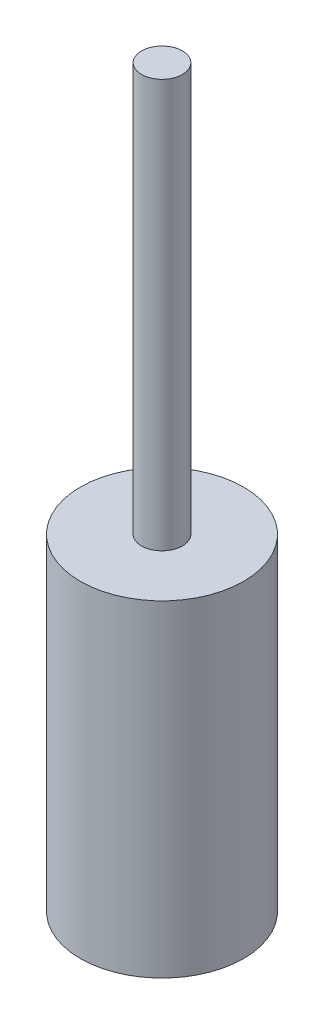
ISO-10303-21;
HEADER;
FILE_DESCRIPTION(('STEP AP214'),'2;1');
FILE_NAME('part.step','',(''),(''),'','','');
FILE_SCHEMA(('AUTOMOTIVE_DESIGN { 1 0 10303 214 1 1 1 1 }'));
ENDSEC;
DATA;
#1=APPLICATION_CONTEXT('core data for automotive mechanical design processes');
#2=APPLICATION_PROTOCOL_DEFINITION('international standard','automotive_design',2000,#1);
#3=PRODUCT_CONTEXT('',#1,'mechanical');
#4=PRODUCT('Part','Part','',(#3));
#5=PRODUCT_RELATED_PRODUCT_CATEGORY('part','',(#4));
#6=PRODUCT_DEFINITION_FORMATION('','',#4);
#7=PRODUCT_DEFINITION_CONTEXT('part definition',#1,'design');
#8=PRODUCT_DEFINITION('design','',#6,#7);
#9=PRODUCT_DEFINITION_SHAPE('','',#8);
#10=(LENGTH_UNIT() NAMED_UNIT(*) SI_UNIT(.MILLI.,.METRE.));
#11=(NAMED_UNIT(*) PLANE_ANGLE_UNIT() SI_UNIT($,.RADIAN.));
#12=(NAMED_UNIT(*) SI_UNIT($,.STERADIAN.) SOLID_ANGLE_UNIT());
#13=UNCERTAINTY_MEASURE_WITH_UNIT(LENGTH_MEASURE(1.E-05),#10,'distance_accuracy_value','');
#14=(GEOMETRIC_REPRESENTATION_CONTEXT(3) GLOBAL_UNCERTAINTY_ASSIGNED_CONTEXT((#13)) GLOBAL_UNIT_ASSIGNED_CONTEXT((#10,
#11,#12)) REPRESENTATION_CONTEXT('',''));
#15=CARTESIAN_POINT('',(0.,0.,0.));
#16=DIRECTION('',(0.,0.,1.));
#17=DIRECTION('',(1.,0.,0.));
#18=AXIS2_PLACEMENT_3D('',#15,#16,#17);
#19=CARTESIAN_POINT('',(0.,40.,0.));
#20=DIRECTION('',(0.,-1.,0.));
#21=DIRECTION('',(0.,0.,-1.));
#22=AXIS2_PLACEMENT_3D('',#19,#20,#21);
#23=CYLINDRICAL_SURFACE('',#22,10.);
#24=CARTESIAN_POINT('',(0.,40.,0.));
#25=DIRECTION('',(0.,1.,0.));
#26=DIRECTION('',(0.,0.,1.));
#27=AXIS2_PLACEMENT_3D('',#24,#25,#26);
#28=CIRCLE('',#27,10.);
#29=CARTESIAN_POINT('',(0.,40.,10.));
#30=VERTEX_POINT('',#29);
#31=EDGE_CURVE('E57',#30,#30,#28,.T.);
#32=ORIENTED_EDGE('',*,*,#31,.F.);
#33=EDGE_LOOP('',(#32));
#34=FACE_BOUND('',#33,.T.);
#35=CARTESIAN_POINT('',(0.,0.,0.));
#36=DIRECTION('',(0.,1.,0.));
#37=DIRECTION('',(0.,0.,1.));
#38=AXIS2_PLACEMENT_3D('',#35,#36,#37);
#39=CIRCLE('',#38,10.);
#40=CARTESIAN_POINT('',(0.,0.,10.));
#41=VERTEX_POINT('',#40);
#42=EDGE_CURVE('E51',#41,#41,#39,.T.);
#43=ORIENTED_EDGE('',*,*,#42,.T.);
#44=EDGE_LOOP('',(#43));
#45=FACE_BOUND('',#44,.T.);
#46=ADVANCED_FACE('F48',(#34,#45),#23,.T.);
#47=CARTESIAN_POINT('',(0.,40.,0.));
#48=DIRECTION('',(0.,1.,0.));
#49=DIRECTION('',(0.,0.,1.));
#50=AXIS2_PLACEMENT_3D('',#47,#48,#49);
#51=PLANE('',#50);
#52=CARTESIAN_POINT('',(0.,40.,0.));
#53=DIRECTION('',(0.,1.,0.));
#54=DIRECTION('',(0.,0.,1.));
#55=AXIS2_PLACEMENT_3D('',#52,#53,#54);
#56=CIRCLE('',#55,2.5);
#57=CARTESIAN_POINT('',(0.,40.,2.5));
#58=VERTEX_POINT('',#57);
#59=EDGE_CURVE('E10',#58,#58,#56,.T.);
#60=ORIENTED_EDGE('',*,*,#59,.F.);
#61=EDGE_LOOP('',(#60));
#62=FACE_BOUND('',#61,.T.);
#63=ORIENTED_EDGE('',*,*,#31,.T.);
#64=EDGE_LOOP('',(#63));
#65=FACE_BOUND('',#64,.T.);
#66=ADVANCED_FACE('F86',(#62,#65),#51,.T.);
#67=CARTESIAN_POINT('',(0.,0.,0.));
#68=DIRECTION('',(0.,1.,0.));
#69=DIRECTION('',(0.,0.,1.));
#70=AXIS2_PLACEMENT_3D('',#67,#68,#69);
#71=PLANE('',#70);
#72=CARTESIAN_POINT('',(0.,0.,0.));
#73=DIRECTION('',(0.,1.,0.));
#74=DIRECTION('',(0.,0.,1.));
#75=AXIS2_PLACEMENT_3D('',#72,#73,#74);
#76=CIRCLE('',#75,5.);
#77=CARTESIAN_POINT('',(0.,0.,5.));
#78=VERTEX_POINT('',#77);
#79=EDGE_CURVE('E69',#78,#78,#76,.T.);
#80=ORIENTED_EDGE('',*,*,#79,.T.);
#81=EDGE_LOOP('',(#80));
#82=FACE_BOUND('',#81,.T.);
#83=ORIENTED_EDGE('',*,*,#42,.F.);
#84=EDGE_LOOP('',(#83));
#85=FACE_BOUND('',#84,.T.);
#86=ADVANCED_FACE('F91',(#82,#85),#71,.F.);
#87=CARTESIAN_POINT('',(0.,90.,0.));
#88=DIRECTION('',(0.,-1.,0.));
#89=DIRECTION('',(0.,0.,-1.));
#90=AXIS2_PLACEMENT_3D('',#87,#88,#89);
#91=CYLINDRICAL_SURFACE('',#90,2.5);
#92=CARTESIAN_POINT('',(0.,90.,0.));
#93=DIRECTION('',(0.,1.,0.));
#94=DIRECTION('',(0.,0.,1.));
#95=AXIS2_PLACEMENT_3D('',#92,#93,#94);
#96=CIRCLE('',#95,2.5);
#97=CARTESIAN_POINT('',(0.,90.,2.5));
#98=VERTEX_POINT('',#97);
#99=EDGE_CURVE('E64',#98,#98,#96,.T.);
#100=ORIENTED_EDGE('',*,*,#99,.F.);
#101=EDGE_LOOP('',(#100));
#102=FACE_BOUND('',#101,.T.);
#103=ORIENTED_EDGE('',*,*,#59,.T.);
#104=EDGE_LOOP('',(#103));
#105=FACE_BOUND('',#104,.T.);
#106=ADVANCED_FACE('F103',(#102,#105),#91,.T.);
#107=CARTESIAN_POINT('',(0.,90.,0.));
#108=DIRECTION('',(0.,1.,0.));
#109=DIRECTION('',(0.,0.,1.));
#110=AXIS2_PLACEMENT_3D('',#107,#108,#109);
#111=PLANE('',#110);
#112=ORIENTED_EDGE('',*,*,#99,.T.);
#113=EDGE_LOOP('',(#112));
#114=FACE_BOUND('',#113,.T.);
#115=ADVANCED_FACE('F85',(#114),#111,.T.);
#116=CARTESIAN_POINT('',(0.,20.,0.));
#117=DIRECTION('',(0.,-1.,0.));
#118=DIRECTION('',(0.,0.,-1.));
#119=AXIS2_PLACEMENT_3D('',#116,#117,#118);
#120=CYLINDRICAL_SURFACE('',#119,5.);
#121=CARTESIAN_POINT('',(0.,20.,0.));
#122=DIRECTION('',(0.,1.,0.));
#123=DIRECTION('',(0.,0.,1.));
#124=AXIS2_PLACEMENT_3D('',#121,#122,#123);
#125=CIRCLE('',#124,5.);
#126=CARTESIAN_POINT('',(0.,20.,5.));
#127=VERTEX_POINT('',#126);
#128=EDGE_CURVE('E67',#127,#127,#125,.T.);
#129=ORIENTED_EDGE('',*,*,#128,.T.);
#130=EDGE_LOOP('',(#129));
#131=FACE_BOUND('',#130,.T.);
#132=ORIENTED_EDGE('',*,*,#79,.F.);
#133=EDGE_LOOP('',(#132));
#134=FACE_BOUND('',#133,.T.);
#135=ADVANCED_FACE('F77',(#131,#134),#120,.F.);
#136=CARTESIAN_POINT('',(0.,20.,0.));
#137=DIRECTION('',(0.,1.,0.));
#138=DIRECTION('',(0.,0.,1.));
#139=AXIS2_PLACEMENT_3D('',#136,#137,#138);
#140=PLANE('',#139);
#141=ORIENTED_EDGE('',*,*,#128,.F.);
#142=EDGE_LOOP('',(#141));
#143=FACE_BOUND('',#142,.T.);
#144=ADVANCED_FACE('F76',(#143),#140,.F.);
#145=CLOSED_SHELL('',(#46,#66,#86,#106,#115,#135,#144));
#146=MANIFOLD_SOLID_BREP('B2',#145);
#147=ADVANCED_BREP_SHAPE_REPRESENTATION('',(#18,#146),#14);
#148=SHAPE_DEFINITION_REPRESENTATION(#9,#147);
ENDSEC;
END-ISO-10303-21;
